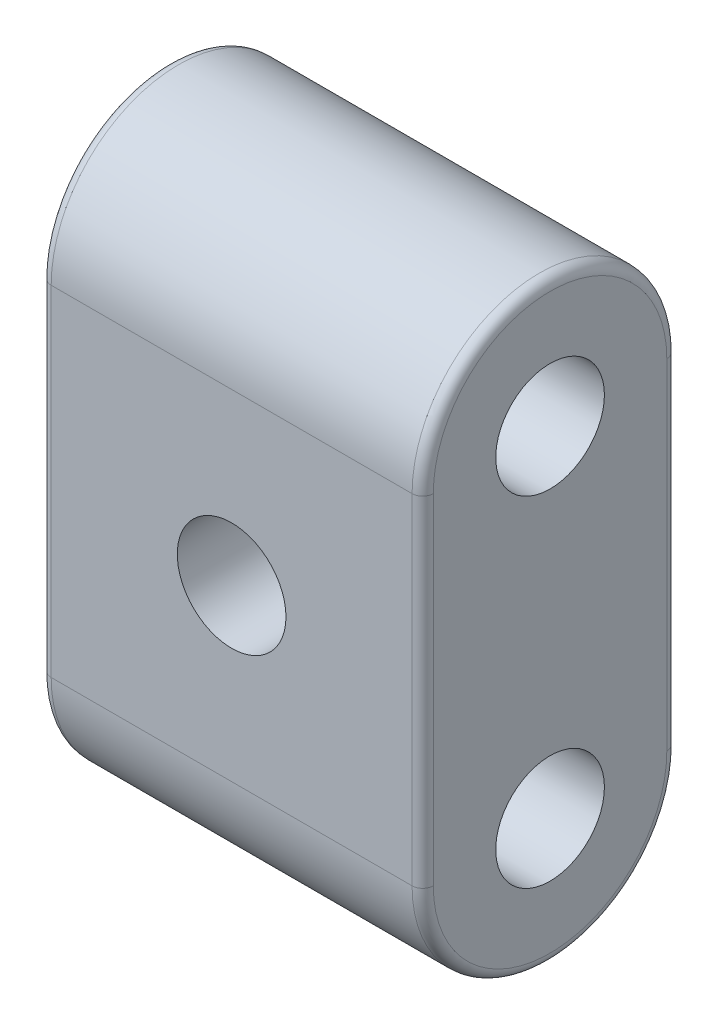
ISO-10303-21;
HEADER;
FILE_DESCRIPTION(('STEP AP214'),'2;1');
FILE_NAME('part.step','',(''),(''),'','','');
FILE_SCHEMA(('AUTOMOTIVE_DESIGN { 1 0 10303 214 1 1 1 1 }'));
ENDSEC;
DATA;
#1=APPLICATION_CONTEXT('core data for automotive mechanical design processes');
#2=APPLICATION_PROTOCOL_DEFINITION('international standard','automotive_design',2000,#1);
#3=PRODUCT_CONTEXT('',#1,'mechanical');
#4=PRODUCT('Part','Part','',(#3));
#5=PRODUCT_RELATED_PRODUCT_CATEGORY('part','',(#4));
#6=PRODUCT_DEFINITION_FORMATION('','',#4);
#7=PRODUCT_DEFINITION_CONTEXT('part definition',#1,'design');
#8=PRODUCT_DEFINITION('design','',#6,#7);
#9=PRODUCT_DEFINITION_SHAPE('','',#8);
#10=(LENGTH_UNIT() NAMED_UNIT(*) SI_UNIT(.MILLI.,.METRE.));
#11=(NAMED_UNIT(*) PLANE_ANGLE_UNIT() SI_UNIT($,.RADIAN.));
#12=(NAMED_UNIT(*) SI_UNIT($,.STERADIAN.) SOLID_ANGLE_UNIT());
#13=UNCERTAINTY_MEASURE_WITH_UNIT(LENGTH_MEASURE(1.E-05),#10,'distance_accuracy_value','');
#14=(GEOMETRIC_REPRESENTATION_CONTEXT(3) GLOBAL_UNCERTAINTY_ASSIGNED_CONTEXT((#13)) GLOBAL_UNIT_ASSIGNED_CONTEXT((#10,
#11,#12)) REPRESENTATION_CONTEXT('',''));
#15=CARTESIAN_POINT('',(0.,0.,0.));
#16=DIRECTION('',(0.,0.,1.));
#17=DIRECTION('',(1.,0.,0.));
#18=AXIS2_PLACEMENT_3D('',#15,#16,#17);
#19=CARTESIAN_POINT('',(7.14375,0.,0.));
#20=DIRECTION('',(1.,0.,0.));
#21=DIRECTION('',(0.,0.,-1.));
#22=AXIS2_PLACEMENT_3D('',#19,#20,#21);
#23=PLANE('',#22);
#24=CARTESIAN_POINT('',(7.14375,0.,0.));
#25=DIRECTION('',(1.,0.,0.));
#26=DIRECTION('',(0.,0.,-1.));
#27=AXIS2_PLACEMENT_3D('',#24,#25,#26);
#28=CIRCLE('',#27,4.365625);
#29=CARTESIAN_POINT('',(7.14375,0.,4.365625));
#30=VERTEX_POINT('',#29);
#31=CARTESIAN_POINT('',(7.14375,0.,-4.365625));
#32=VERTEX_POINT('',#31);
#33=EDGE_CURVE('E57',#30,#32,#28,.T.);
#34=ORIENTED_EDGE('',*,*,#33,.T.);
#35=DIRECTION('',(0.,1.,0.));
#36=VECTOR('',#35,1.);
#37=CARTESIAN_POINT('',(7.14375,12.7,-4.365625));
#38=LINE('',#37,#36);
#39=CARTESIAN_POINT('',(7.14375,12.7,-4.365625));
#40=VERTEX_POINT('',#39);
#41=EDGE_CURVE('E113',#32,#40,#38,.T.);
#42=ORIENTED_EDGE('',*,*,#41,.T.);
#43=CARTESIAN_POINT('',(7.14375,12.7,0.));
#44=DIRECTION('',(1.,0.,0.));
#45=DIRECTION('',(0.,0.,-1.));
#46=AXIS2_PLACEMENT_3D('',#43,#44,#45);
#47=CIRCLE('',#46,4.365625);
#48=CARTESIAN_POINT('',(7.14375,12.7,4.365625));
#49=VERTEX_POINT('',#48);
#50=EDGE_CURVE('E140',#40,#49,#47,.T.);
#51=ORIENTED_EDGE('',*,*,#50,.T.);
#52=DIRECTION('',(0.,-1.,0.));
#53=VECTOR('',#52,1.);
#54=CARTESIAN_POINT('',(7.14375,0.,4.365625));
#55=LINE('',#54,#53);
#56=EDGE_CURVE('E64',#49,#30,#55,.T.);
#57=ORIENTED_EDGE('',*,*,#56,.T.);
#58=EDGE_LOOP('',(#34,#42,#51,#57));
#59=FACE_BOUND('',#58,.T.);
#60=CARTESIAN_POINT('',(7.14375,12.7,0.));
#61=DIRECTION('',(1.,0.,0.));
#62=DIRECTION('',(0.,0.,-1.));
#63=AXIS2_PLACEMENT_3D('',#60,#61,#62);
#64=CIRCLE('',#63,2.032);
#65=CARTESIAN_POINT('',(7.14375,12.7,-2.032));
#66=VERTEX_POINT('',#65);
#67=EDGE_CURVE('E182',#66,#66,#64,.T.);
#68=ORIENTED_EDGE('',*,*,#67,.F.);
#69=EDGE_LOOP('',(#68));
#70=FACE_BOUND('',#69,.T.);
#71=CARTESIAN_POINT('',(7.14375,0.,0.));
#72=DIRECTION('',(1.,0.,0.));
#73=DIRECTION('',(0.,0.,-1.));
#74=AXIS2_PLACEMENT_3D('',#71,#72,#73);
#75=CIRCLE('',#74,2.032);
#76=CARTESIAN_POINT('',(7.14375,0.,-2.032));
#77=VERTEX_POINT('',#76);
#78=EDGE_CURVE('E172',#77,#77,#75,.T.);
#79=ORIENTED_EDGE('',*,*,#78,.F.);
#80=EDGE_LOOP('',(#79));
#81=FACE_BOUND('',#80,.T.);
#82=ADVANCED_FACE('F39',(#59,#70,#81),#23,.T.);
#83=CARTESIAN_POINT('',(-7.14375,0.,0.));
#84=DIRECTION('',(1.,0.,0.));
#85=DIRECTION('',(0.,0.,-1.));
#86=AXIS2_PLACEMENT_3D('',#83,#84,#85);
#87=PLANE('',#86);
#88=CARTESIAN_POINT('',(-7.14375,12.7,0.));
#89=DIRECTION('',(1.,0.,0.));
#90=DIRECTION('',(0.,0.,-1.));
#91=AXIS2_PLACEMENT_3D('',#88,#89,#90);
#92=CIRCLE('',#91,4.365625);
#93=CARTESIAN_POINT('',(-7.14375,12.7,4.365625));
#94=VERTEX_POINT('',#93);
#95=CARTESIAN_POINT('',(-7.14375,12.7,-4.365625));
#96=VERTEX_POINT('',#95);
#97=EDGE_CURVE('E194',#94,#96,#92,.F.);
#98=ORIENTED_EDGE('',*,*,#97,.T.);
#99=DIRECTION('',(0.,1.,0.));
#100=VECTOR('',#99,1.);
#101=CARTESIAN_POINT('',(-7.14375,0.,-4.365625));
#102=LINE('',#101,#100);
#103=CARTESIAN_POINT('',(-7.14375,0.,-4.365625));
#104=VERTEX_POINT('',#103);
#105=EDGE_CURVE('E196',#96,#104,#102,.F.);
#106=ORIENTED_EDGE('',*,*,#105,.T.);
#107=CARTESIAN_POINT('',(-7.14375,0.,0.));
#108=DIRECTION('',(1.,0.,0.));
#109=DIRECTION('',(0.,0.,-1.));
#110=AXIS2_PLACEMENT_3D('',#107,#108,#109);
#111=CIRCLE('',#110,4.365625);
#112=CARTESIAN_POINT('',(-7.14375,0.,4.365625));
#113=VERTEX_POINT('',#112);
#114=EDGE_CURVE('E198',#104,#113,#111,.F.);
#115=ORIENTED_EDGE('',*,*,#114,.T.);
#116=DIRECTION('',(0.,-1.,0.));
#117=VECTOR('',#116,1.);
#118=CARTESIAN_POINT('',(-7.14375,0.,4.365625));
#119=LINE('',#118,#117);
#120=EDGE_CURVE('E191',#113,#94,#119,.F.);
#121=ORIENTED_EDGE('',*,*,#120,.T.);
#122=EDGE_LOOP('',(#98,#106,#115,#121));
#123=FACE_BOUND('',#122,.T.);
#124=CARTESIAN_POINT('',(-7.14375,12.7,0.));
#125=DIRECTION('',(1.,0.,0.));
#126=DIRECTION('',(0.,0.,-1.));
#127=AXIS2_PLACEMENT_3D('',#124,#125,#126);
#128=CIRCLE('',#127,2.032);
#129=CARTESIAN_POINT('',(-7.14375,12.7,-2.032));
#130=VERTEX_POINT('',#129);
#131=EDGE_CURVE('E180',#130,#130,#128,.T.);
#132=ORIENTED_EDGE('',*,*,#131,.T.);
#133=EDGE_LOOP('',(#132));
#134=FACE_BOUND('',#133,.T.);
#135=CARTESIAN_POINT('',(-7.14375,0.,0.));
#136=DIRECTION('',(1.,0.,0.));
#137=DIRECTION('',(0.,0.,-1.));
#138=AXIS2_PLACEMENT_3D('',#135,#136,#137);
#139=CIRCLE('',#138,2.032);
#140=CARTESIAN_POINT('',(-7.14375,0.,-2.032));
#141=VERTEX_POINT('',#140);
#142=EDGE_CURVE('E171',#141,#141,#139,.T.);
#143=ORIENTED_EDGE('',*,*,#142,.T.);
#144=EDGE_LOOP('',(#143));
#145=FACE_BOUND('',#144,.T.);
#146=ADVANCED_FACE('F236',(#123,#134,#145),#87,.F.);
#147=CARTESIAN_POINT('',(7.14375,0.,0.));
#148=DIRECTION('',(-1.,0.,0.));
#149=DIRECTION('',(0.,0.,1.));
#150=AXIS2_PLACEMENT_3D('',#147,#148,#149);
#151=CYLINDRICAL_SURFACE('',#150,4.7625);
#152=DIRECTION('',(-1.,0.,0.));
#153=VECTOR('',#152,1.);
#154=CARTESIAN_POINT('',(7.14375,0.,4.7625));
#155=LINE('',#154,#153);
#156=CARTESIAN_POINT('',(6.746875,0.,4.7625));
#157=VERTEX_POINT('',#156);
#158=CARTESIAN_POINT('',(-6.746875,0.,4.7625));
#159=VERTEX_POINT('',#158);
#160=EDGE_CURVE('E184',#157,#159,#155,.T.);
#161=ORIENTED_EDGE('',*,*,#160,.T.);
#162=CARTESIAN_POINT('',(-6.746875,0.,0.));
#163=DIRECTION('',(1.,0.,0.));
#164=DIRECTION('',(0.,0.,-1.));
#165=AXIS2_PLACEMENT_3D('',#162,#163,#164);
#166=CIRCLE('',#165,4.7625);
#167=CARTESIAN_POINT('',(-6.746875,0.,-4.7625));
#168=VERTEX_POINT('',#167);
#169=EDGE_CURVE('E201',#159,#168,#166,.T.);
#170=ORIENTED_EDGE('',*,*,#169,.T.);
#171=DIRECTION('',(-1.,0.,0.));
#172=VECTOR('',#171,1.);
#173=CARTESIAN_POINT('',(7.14375,0.,-4.7625));
#174=LINE('',#173,#172);
#175=CARTESIAN_POINT('',(6.746875,0.,-4.7625));
#176=VERTEX_POINT('',#175);
#177=EDGE_CURVE('E130',#176,#168,#174,.T.);
#178=ORIENTED_EDGE('',*,*,#177,.F.);
#179=CARTESIAN_POINT('',(6.746875,0.,0.));
#180=DIRECTION('',(1.,0.,0.));
#181=DIRECTION('',(0.,0.,-1.));
#182=AXIS2_PLACEMENT_3D('',#179,#180,#181);
#183=CIRCLE('',#182,4.7625);
#184=EDGE_CURVE('E203',#176,#157,#183,.F.);
#185=ORIENTED_EDGE('',*,*,#184,.T.);
#186=EDGE_LOOP('',(#161,#170,#178,#185));
#187=FACE_BOUND('',#186,.T.);
#188=ADVANCED_FACE('F217',(#187),#151,.T.);
#189=CARTESIAN_POINT('',(7.14375,0.,-4.7625));
#190=DIRECTION('',(0.,0.,1.));
#191=DIRECTION('',(1.,0.,0.));
#192=AXIS2_PLACEMENT_3D('',#189,#190,#191);
#193=PLANE('',#192);
#194=CARTESIAN_POINT('',(0.,6.35,-4.7625));
#195=DIRECTION('',(0.,0.,1.));
#196=DIRECTION('',(1.,0.,0.));
#197=AXIS2_PLACEMENT_3D('',#194,#195,#196);
#198=CIRCLE('',#197,2.032);
#199=CARTESIAN_POINT('',(2.032,6.35,-4.7625));
#200=VERTEX_POINT('',#199);
#201=EDGE_CURVE('E170',#200,#200,#198,.T.);
#202=ORIENTED_EDGE('',*,*,#201,.T.);
#203=EDGE_LOOP('',(#202));
#204=FACE_BOUND('',#203,.T.);
#205=ORIENTED_EDGE('',*,*,#177,.T.);
#206=DIRECTION('',(0.,1.,0.));
#207=VECTOR('',#206,1.);
#208=CARTESIAN_POINT('',(-6.746875,0.,-4.7625));
#209=LINE('',#208,#207);
#210=CARTESIAN_POINT('',(-6.746875,12.7,-4.7625));
#211=VERTEX_POINT('',#210);
#212=EDGE_CURVE('E127',#168,#211,#209,.T.);
#213=ORIENTED_EDGE('',*,*,#212,.T.);
#214=DIRECTION('',(-1.,0.,0.));
#215=VECTOR('',#214,1.);
#216=CARTESIAN_POINT('',(7.14375,12.7,-4.7625));
#217=LINE('',#216,#215);
#218=CARTESIAN_POINT('',(6.746875,12.7,-4.7625));
#219=VERTEX_POINT('',#218);
#220=EDGE_CURVE('E107',#219,#211,#217,.T.);
#221=ORIENTED_EDGE('',*,*,#220,.F.);
#222=DIRECTION('',(0.,1.,0.));
#223=VECTOR('',#222,1.);
#224=CARTESIAN_POINT('',(6.746875,0.,-4.7625));
#225=LINE('',#224,#223);
#226=EDGE_CURVE('E125',#219,#176,#225,.F.);
#227=ORIENTED_EDGE('',*,*,#226,.T.);
#228=EDGE_LOOP('',(#205,#213,#221,#227));
#229=FACE_BOUND('',#228,.T.);
#230=ADVANCED_FACE('F124',(#204,#229),#193,.F.);
#231=CARTESIAN_POINT('',(7.14375,12.7,0.));
#232=DIRECTION('',(-1.,0.,0.));
#233=DIRECTION('',(0.,0.,1.));
#234=AXIS2_PLACEMENT_3D('',#231,#232,#233);
#235=CYLINDRICAL_SURFACE('',#234,4.7625);
#236=ORIENTED_EDGE('',*,*,#220,.T.);
#237=CARTESIAN_POINT('',(-6.746875,12.7,0.));
#238=DIRECTION('',(1.,0.,0.));
#239=DIRECTION('',(0.,0.,-1.));
#240=AXIS2_PLACEMENT_3D('',#237,#238,#239);
#241=CIRCLE('',#240,4.7625);
#242=CARTESIAN_POINT('',(-6.746875,12.7,4.7625));
#243=VERTEX_POINT('',#242);
#244=EDGE_CURVE('E11',#211,#243,#241,.T.);
#245=ORIENTED_EDGE('',*,*,#244,.T.);
#246=DIRECTION('',(-1.,0.,0.));
#247=VECTOR('',#246,1.);
#248=CARTESIAN_POINT('',(7.14375,12.7,4.7625));
#249=LINE('',#248,#247);
#250=CARTESIAN_POINT('',(6.746875,12.7,4.7625));
#251=VERTEX_POINT('',#250);
#252=EDGE_CURVE('E109',#251,#243,#249,.T.);
#253=ORIENTED_EDGE('',*,*,#252,.F.);
#254=CARTESIAN_POINT('',(6.746875,12.7,0.));
#255=DIRECTION('',(1.,0.,0.));
#256=DIRECTION('',(0.,0.,-1.));
#257=AXIS2_PLACEMENT_3D('',#254,#255,#256);
#258=CIRCLE('',#257,4.7625);
#259=EDGE_CURVE('E48',#251,#219,#258,.F.);
#260=ORIENTED_EDGE('',*,*,#259,.T.);
#261=EDGE_LOOP('',(#236,#245,#253,#260));
#262=FACE_BOUND('',#261,.T.);
#263=ADVANCED_FACE('F110',(#262),#235,.T.);
#264=CARTESIAN_POINT('',(7.14375,0.,4.7625));
#265=DIRECTION('',(0.,0.,-1.));
#266=DIRECTION('',(-1.,0.,0.));
#267=AXIS2_PLACEMENT_3D('',#264,#265,#266);
#268=PLANE('',#267);
#269=CARTESIAN_POINT('',(0.,6.35,4.7625));
#270=DIRECTION('',(0.,0.,1.));
#271=DIRECTION('',(1.,0.,0.));
#272=AXIS2_PLACEMENT_3D('',#269,#270,#271);
#273=CIRCLE('',#272,2.032);
#274=CARTESIAN_POINT('',(2.032,6.35,4.7625));
#275=VERTEX_POINT('',#274);
#276=EDGE_CURVE('E161',#275,#275,#273,.T.);
#277=ORIENTED_EDGE('',*,*,#276,.F.);
#278=EDGE_LOOP('',(#277));
#279=FACE_BOUND('',#278,.T.);
#280=ORIENTED_EDGE('',*,*,#252,.T.);
#281=DIRECTION('',(0.,-1.,0.));
#282=VECTOR('',#281,1.);
#283=CARTESIAN_POINT('',(-6.746875,0.,4.7625));
#284=LINE('',#283,#282);
#285=EDGE_CURVE('E210',#243,#159,#284,.T.);
#286=ORIENTED_EDGE('',*,*,#285,.T.);
#287=ORIENTED_EDGE('',*,*,#160,.F.);
#288=DIRECTION('',(0.,-1.,0.));
#289=VECTOR('',#288,1.);
#290=CARTESIAN_POINT('',(6.746875,12.7,4.7625));
#291=LINE('',#290,#289);
#292=EDGE_CURVE('E202',#157,#251,#291,.F.);
#293=ORIENTED_EDGE('',*,*,#292,.T.);
#294=EDGE_LOOP('',(#280,#286,#287,#293));
#295=FACE_BOUND('',#294,.T.);
#296=ADVANCED_FACE('F219',(#279,#295),#268,.F.);
#297=CARTESIAN_POINT('',(7.14375,12.7,0.));
#298=DIRECTION('',(-1.,0.,0.));
#299=DIRECTION('',(0.,0.,1.));
#300=AXIS2_PLACEMENT_3D('',#297,#298,#299);
#301=CYLINDRICAL_SURFACE('',#300,2.032);
#302=ORIENTED_EDGE('',*,*,#67,.T.);
#303=EDGE_LOOP('',(#302));
#304=FACE_BOUND('',#303,.T.);
#305=ORIENTED_EDGE('',*,*,#131,.F.);
#306=EDGE_LOOP('',(#305));
#307=FACE_BOUND('',#306,.T.);
#308=ADVANCED_FACE('F249',(#304,#307),#301,.F.);
#309=CARTESIAN_POINT('',(7.14375,0.,0.));
#310=DIRECTION('',(-1.,0.,0.));
#311=DIRECTION('',(0.,0.,1.));
#312=AXIS2_PLACEMENT_3D('',#309,#310,#311);
#313=CYLINDRICAL_SURFACE('',#312,2.032);
#314=ORIENTED_EDGE('',*,*,#78,.T.);
#315=EDGE_LOOP('',(#314));
#316=FACE_BOUND('',#315,.T.);
#317=ORIENTED_EDGE('',*,*,#142,.F.);
#318=EDGE_LOOP('',(#317));
#319=FACE_BOUND('',#318,.T.);
#320=ADVANCED_FACE('F342',(#316,#319),#313,.F.);
#321=CARTESIAN_POINT('',(0.,6.35,-4.7625));
#322=DIRECTION('',(0.,0.,1.));
#323=DIRECTION('',(1.,0.,0.));
#324=AXIS2_PLACEMENT_3D('',#321,#322,#323);
#325=CYLINDRICAL_SURFACE('',#324,2.032);
#326=CARTESIAN_POINT('',(2.032,6.35,-4.7625));
#327=CARTESIAN_POINT('',(2.032,6.35,-4.66328125));
#328=CARTESIAN_POINT('',(2.032,6.35,-4.5640625));
#329=CARTESIAN_POINT('',(2.032,6.35,-4.365625));
#330=CARTESIAN_POINT('',(2.032,6.35,-4.26640625));
#331=CARTESIAN_POINT('',(2.032,6.35,-4.06796875));
#332=CARTESIAN_POINT('',(2.032,6.35,-3.96875));
#333=CARTESIAN_POINT('',(2.032,6.35,-3.7703125));
#334=CARTESIAN_POINT('',(2.032,6.35,-3.67109375));
#335=CARTESIAN_POINT('',(2.032,6.35,-3.47265625));
#336=CARTESIAN_POINT('',(2.032,6.35,-3.3734375));
#337=CARTESIAN_POINT('',(2.032,6.35,-3.175));
#338=CARTESIAN_POINT('',(2.032,6.35,-3.07578125));
#339=CARTESIAN_POINT('',(2.032,6.35,-2.87734375));
#340=CARTESIAN_POINT('',(2.032,6.35,-2.778125));
#341=CARTESIAN_POINT('',(2.032,6.35,-2.5796875));
#342=CARTESIAN_POINT('',(2.032,6.35,-2.48046875));
#343=CARTESIAN_POINT('',(2.032,6.35,-2.28203125));
#344=CARTESIAN_POINT('',(2.032,6.35,-2.1828125));
#345=CARTESIAN_POINT('',(2.032,6.35,-1.984375));
#346=CARTESIAN_POINT('',(2.032,6.35,-1.88515625));
#347=CARTESIAN_POINT('',(2.032,6.35,-1.68671875));
#348=CARTESIAN_POINT('',(2.032,6.35,-1.5875));
#349=CARTESIAN_POINT('',(2.032,6.35,-1.3890625));
#350=CARTESIAN_POINT('',(2.032,6.35,-1.28984375));
#351=CARTESIAN_POINT('',(2.032,6.35,-1.09140625));
#352=CARTESIAN_POINT('',(2.032,6.35,-0.9921875));
#353=CARTESIAN_POINT('',(2.032,6.35,-0.79375));
#354=CARTESIAN_POINT('',(2.032,6.35,-0.69453125));
#355=CARTESIAN_POINT('',(2.032,6.35,-0.49609375));
#356=CARTESIAN_POINT('',(2.032,6.35,-0.396875));
#357=CARTESIAN_POINT('',(2.032,6.35,-0.1984375));
#358=CARTESIAN_POINT('',(2.032,6.35,-0.0992187500000001));
#359=CARTESIAN_POINT('',(2.032,6.35,0.0992187500000001));
#360=CARTESIAN_POINT('',(2.032,6.35,0.1984375));
#361=CARTESIAN_POINT('',(2.032,6.35,0.396875));
#362=CARTESIAN_POINT('',(2.032,6.35,0.49609375));
#363=CARTESIAN_POINT('',(2.032,6.35,0.69453125));
#364=CARTESIAN_POINT('',(2.032,6.35,0.793750000000001));
#365=CARTESIAN_POINT('',(2.032,6.35,0.992187500000001));
#366=CARTESIAN_POINT('',(2.032,6.35,1.09140625));
#367=CARTESIAN_POINT('',(2.032,6.35,1.28984375));
#368=CARTESIAN_POINT('',(2.032,6.35,1.3890625));
#369=CARTESIAN_POINT('',(2.032,6.35,1.5875));
#370=CARTESIAN_POINT('',(2.032,6.35,1.68671875));
#371=CARTESIAN_POINT('',(2.032,6.35,1.88515625));
#372=CARTESIAN_POINT('',(2.032,6.35,1.984375));
#373=CARTESIAN_POINT('',(2.032,6.35,2.1828125));
#374=CARTESIAN_POINT('',(2.032,6.35,2.28203125));
#375=CARTESIAN_POINT('',(2.032,6.35,2.48046875));
#376=CARTESIAN_POINT('',(2.032,6.35,2.5796875));
#377=CARTESIAN_POINT('',(2.032,6.35,2.778125));
#378=CARTESIAN_POINT('',(2.032,6.35,2.87734375));
#379=CARTESIAN_POINT('',(2.032,6.35,3.07578125));
#380=CARTESIAN_POINT('',(2.032,6.35,3.175));
#381=CARTESIAN_POINT('',(2.032,6.35,3.3734375));
#382=CARTESIAN_POINT('',(2.032,6.35,3.47265625));
#383=CARTESIAN_POINT('',(2.032,6.35,3.67109375));
#384=CARTESIAN_POINT('',(2.032,6.35,3.7703125));
#385=CARTESIAN_POINT('',(2.032,6.35,3.96875));
#386=CARTESIAN_POINT('',(2.032,6.35,4.06796875));
#387=CARTESIAN_POINT('',(2.032,6.35,4.26640625));
#388=CARTESIAN_POINT('',(2.032,6.35,4.365625));
#389=CARTESIAN_POINT('',(2.032,6.35,4.5640625));
#390=CARTESIAN_POINT('',(2.032,6.35,4.66328125));
#391=CARTESIAN_POINT('',(2.032,6.35,4.7625));
#392=B_SPLINE_CURVE_WITH_KNOTS('',3,(#326,#327,#328,#329,#330,#331,#332,#333,#334,#335,#336,
#337,#338,#339,#340,#341,#342,#343,#344,#345,#346,#347,#348,#349,#350,#351,#352,#353,#354,#355,
#356,#357,#358,#359,#360,#361,#362,#363,#364,#365,#366,#367,#368,#369,#370,#371,#372,#373,#374,
#375,#376,#377,#378,#379,#380,#381,#382,#383,#384,#385,#386,#387,#388,#389,#390,#391),
.UNSPECIFIED.,.F.,.F.,(4,2,2,2,2,2,2,2,2,2,2,2,2,2,2,2,2,2,2,2,2,2,2,2,2,2,2,2,2,2,2,2,4),(0.,
0.297656249999999,0.595312499999999,0.89296875,1.190625,1.48828125,1.7859375,2.08359375,2.38125,
2.67890625,2.9765625,3.27421875,3.571875,3.86953125,4.1671875,4.46484375,4.7625,5.06015625,
5.3578125,5.65546875,5.953125,6.25078125,6.5484375,6.84609375,7.14375,7.44140625,7.7390625,
8.03671875,8.334375,8.63203125,8.9296875,9.22734375,9.525),.UNSPECIFIED.);
#393=EDGE_CURVE('BSEAM282',#200,#275,#392,.T.);
#394=ORIENTED_EDGE('',*,*,#201,.F.);
#395=ORIENTED_EDGE('',*,*,#276,.T.);
#396=ORIENTED_EDGE('',*,*,#393,.T.);
#397=ORIENTED_EDGE('',*,*,#393,.F.);
#398=EDGE_LOOP('',(#394,#396,#395,#397));
#399=FACE_BOUND('',#398,.T.);
#400=ADVANCED_FACE('F282',(#399),#325,.F.);
#401=CARTESIAN_POINT('',(-6.746875,0.,4.365625));
#402=DIRECTION('',(0.,-1.,0.));
#403=DIRECTION('',(0.,0.,-1.));
#404=AXIS2_PLACEMENT_3D('',#401,#402,#403);
#405=CYLINDRICAL_SURFACE('',#404,0.396875);
#406=CARTESIAN_POINT('',(-6.746875,12.7,4.365625));
#407=DIRECTION('',(0.,1.,0.));
#408=DIRECTION('',(0.,0.,1.));
#409=AXIS2_PLACEMENT_3D('',#406,#407,#408);
#410=CIRCLE('',#409,0.396875);
#411=EDGE_CURVE('E152',#94,#243,#410,.T.);
#412=ORIENTED_EDGE('',*,*,#411,.F.);
#413=ORIENTED_EDGE('',*,*,#120,.F.);
#414=CARTESIAN_POINT('',(-6.746875,0.,4.365625));
#415=DIRECTION('',(0.,-1.,0.));
#416=DIRECTION('',(0.,0.,-1.));
#417=AXIS2_PLACEMENT_3D('',#414,#415,#416);
#418=CIRCLE('',#417,0.396875);
#419=EDGE_CURVE('E141',#159,#113,#418,.T.);
#420=ORIENTED_EDGE('',*,*,#419,.F.);
#421=ORIENTED_EDGE('',*,*,#285,.F.);
#422=EDGE_LOOP('',(#412,#413,#420,#421));
#423=FACE_BOUND('',#422,.T.);
#424=ADVANCED_FACE('F224',(#423),#405,.T.);
#425=CARTESIAN_POINT('',(-6.746875,0.,0.));
#426=DIRECTION('',(1.,0.,0.));
#427=DIRECTION('',(0.,0.,-1.));
#428=AXIS2_PLACEMENT_3D('',#425,#426,#427);
#429=TOROIDAL_SURFACE('',#428,4.365625,0.396875);
#430=ORIENTED_EDGE('',*,*,#419,.T.);
#431=ORIENTED_EDGE('',*,*,#114,.F.);
#432=CARTESIAN_POINT('',(-6.746875,0.,-4.365625));
#433=DIRECTION('',(0.,1.,0.));
#434=DIRECTION('',(0.,0.,1.));
#435=AXIS2_PLACEMENT_3D('',#432,#433,#434);
#436=CIRCLE('',#435,0.396875);
#437=EDGE_CURVE('E146',#168,#104,#436,.T.);
#438=ORIENTED_EDGE('',*,*,#437,.F.);
#439=ORIENTED_EDGE('',*,*,#169,.F.);
#440=EDGE_LOOP('',(#430,#431,#438,#439));
#441=FACE_BOUND('',#440,.T.);
#442=ADVANCED_FACE('F229',(#441),#429,.T.);
#443=CARTESIAN_POINT('',(-6.746875,12.7,0.));
#444=DIRECTION('',(1.,0.,0.));
#445=DIRECTION('',(0.,0.,-1.));
#446=AXIS2_PLACEMENT_3D('',#443,#444,#445);
#447=TOROIDAL_SURFACE('',#446,4.365625,0.396875);
#448=ORIENTED_EDGE('',*,*,#411,.T.);
#449=ORIENTED_EDGE('',*,*,#244,.F.);
#450=CARTESIAN_POINT('',(-6.746875,12.7,-4.365625));
#451=DIRECTION('',(0.,-1.,0.));
#452=DIRECTION('',(0.,0.,-1.));
#453=AXIS2_PLACEMENT_3D('',#450,#451,#452);
#454=CIRCLE('',#453,0.396875);
#455=EDGE_CURVE('E148',#96,#211,#454,.T.);
#456=ORIENTED_EDGE('',*,*,#455,.F.);
#457=ORIENTED_EDGE('',*,*,#97,.F.);
#458=EDGE_LOOP('',(#448,#449,#456,#457));
#459=FACE_BOUND('',#458,.T.);
#460=ADVANCED_FACE('F228',(#459),#447,.T.);
#461=CARTESIAN_POINT('',(-6.746875,0.,-4.365625));
#462=DIRECTION('',(0.,1.,0.));
#463=DIRECTION('',(0.,0.,1.));
#464=AXIS2_PLACEMENT_3D('',#461,#462,#463);
#465=CYLINDRICAL_SURFACE('',#464,0.396875);
#466=ORIENTED_EDGE('',*,*,#437,.T.);
#467=ORIENTED_EDGE('',*,*,#105,.F.);
#468=ORIENTED_EDGE('',*,*,#455,.T.);
#469=ORIENTED_EDGE('',*,*,#212,.F.);
#470=EDGE_LOOP('',(#466,#467,#468,#469));
#471=FACE_BOUND('',#470,.T.);
#472=ADVANCED_FACE('F226',(#471),#465,.T.);
#473=CARTESIAN_POINT('',(6.746875,0.,4.365625));
#474=DIRECTION('',(0.,1.,0.));
#475=DIRECTION('',(0.,0.,1.));
#476=AXIS2_PLACEMENT_3D('',#473,#474,#475);
#477=CYLINDRICAL_SURFACE('',#476,0.396875);
#478=CARTESIAN_POINT('',(6.746875,12.7,4.365625));
#479=DIRECTION('',(0.,1.,0.));
#480=DIRECTION('',(0.,0.,1.));
#481=AXIS2_PLACEMENT_3D('',#478,#479,#480);
#482=CIRCLE('',#481,0.396875);
#483=EDGE_CURVE('E138',#251,#49,#482,.T.);
#484=ORIENTED_EDGE('',*,*,#483,.F.);
#485=ORIENTED_EDGE('',*,*,#292,.F.);
#486=CARTESIAN_POINT('',(6.746875,0.,4.365625));
#487=DIRECTION('',(0.,-1.,0.));
#488=DIRECTION('',(0.,0.,-1.));
#489=AXIS2_PLACEMENT_3D('',#486,#487,#488);
#490=CIRCLE('',#489,0.396875);
#491=EDGE_CURVE('E43',#30,#157,#490,.T.);
#492=ORIENTED_EDGE('',*,*,#491,.F.);
#493=ORIENTED_EDGE('',*,*,#56,.F.);
#494=EDGE_LOOP('',(#484,#485,#492,#493));
#495=FACE_BOUND('',#494,.T.);
#496=ADVANCED_FACE('F41',(#495),#477,.T.);
#497=CARTESIAN_POINT('',(6.746875,0.,0.));
#498=DIRECTION('',(1.,0.,0.));
#499=DIRECTION('',(0.,0.,-1.));
#500=AXIS2_PLACEMENT_3D('',#497,#498,#499);
#501=TOROIDAL_SURFACE('',#500,4.365625,0.396875);
#502=ORIENTED_EDGE('',*,*,#491,.T.);
#503=ORIENTED_EDGE('',*,*,#184,.F.);
#504=CARTESIAN_POINT('',(6.746875,0.,-4.365625));
#505=DIRECTION('',(0.,1.,0.));
#506=DIRECTION('',(0.,0.,1.));
#507=AXIS2_PLACEMENT_3D('',#504,#505,#506);
#508=CIRCLE('',#507,0.396875);
#509=EDGE_CURVE('E133',#32,#176,#508,.T.);
#510=ORIENTED_EDGE('',*,*,#509,.F.);
#511=ORIENTED_EDGE('',*,*,#33,.F.);
#512=EDGE_LOOP('',(#502,#503,#510,#511));
#513=FACE_BOUND('',#512,.T.);
#514=ADVANCED_FACE('F214',(#513),#501,.T.);
#515=CARTESIAN_POINT('',(6.746875,12.7,0.));
#516=DIRECTION('',(1.,0.,0.));
#517=DIRECTION('',(0.,0.,-1.));
#518=AXIS2_PLACEMENT_3D('',#515,#516,#517);
#519=TOROIDAL_SURFACE('',#518,4.365625,0.396875);
#520=ORIENTED_EDGE('',*,*,#483,.T.);
#521=ORIENTED_EDGE('',*,*,#50,.F.);
#522=CARTESIAN_POINT('',(6.746875,12.7,-4.365625));
#523=DIRECTION('',(0.,-1.,0.));
#524=DIRECTION('',(0.,0.,-1.));
#525=AXIS2_PLACEMENT_3D('',#522,#523,#524);
#526=CIRCLE('',#525,0.396875);
#527=EDGE_CURVE('E131',#219,#40,#526,.T.);
#528=ORIENTED_EDGE('',*,*,#527,.F.);
#529=ORIENTED_EDGE('',*,*,#259,.F.);
#530=EDGE_LOOP('',(#520,#521,#528,#529));
#531=FACE_BOUND('',#530,.T.);
#532=ADVANCED_FACE('F139',(#531),#519,.T.);
#533=CARTESIAN_POINT('',(6.746875,0.,-4.365625));
#534=DIRECTION('',(0.,-1.,0.));
#535=DIRECTION('',(0.,0.,-1.));
#536=AXIS2_PLACEMENT_3D('',#533,#534,#535);
#537=CYLINDRICAL_SURFACE('',#536,0.396875);
#538=ORIENTED_EDGE('',*,*,#509,.T.);
#539=ORIENTED_EDGE('',*,*,#226,.F.);
#540=ORIENTED_EDGE('',*,*,#527,.T.);
#541=ORIENTED_EDGE('',*,*,#41,.F.);
#542=EDGE_LOOP('',(#538,#539,#540,#541));
#543=FACE_BOUND('',#542,.T.);
#544=ADVANCED_FACE('F128',(#543),#537,.T.);
#545=CLOSED_SHELL('',(#82,#146,#188,#230,#263,#296,#308,#320,#400,#424,#442,#460,#472,#496,#514,
#532,#544));
#546=MANIFOLD_SOLID_BREP('B2',#545);
#547=ADVANCED_BREP_SHAPE_REPRESENTATION('',(#18,#546),#14);
#548=SHAPE_DEFINITION_REPRESENTATION(#9,#547);
ENDSEC;
END-ISO-10303-21;
